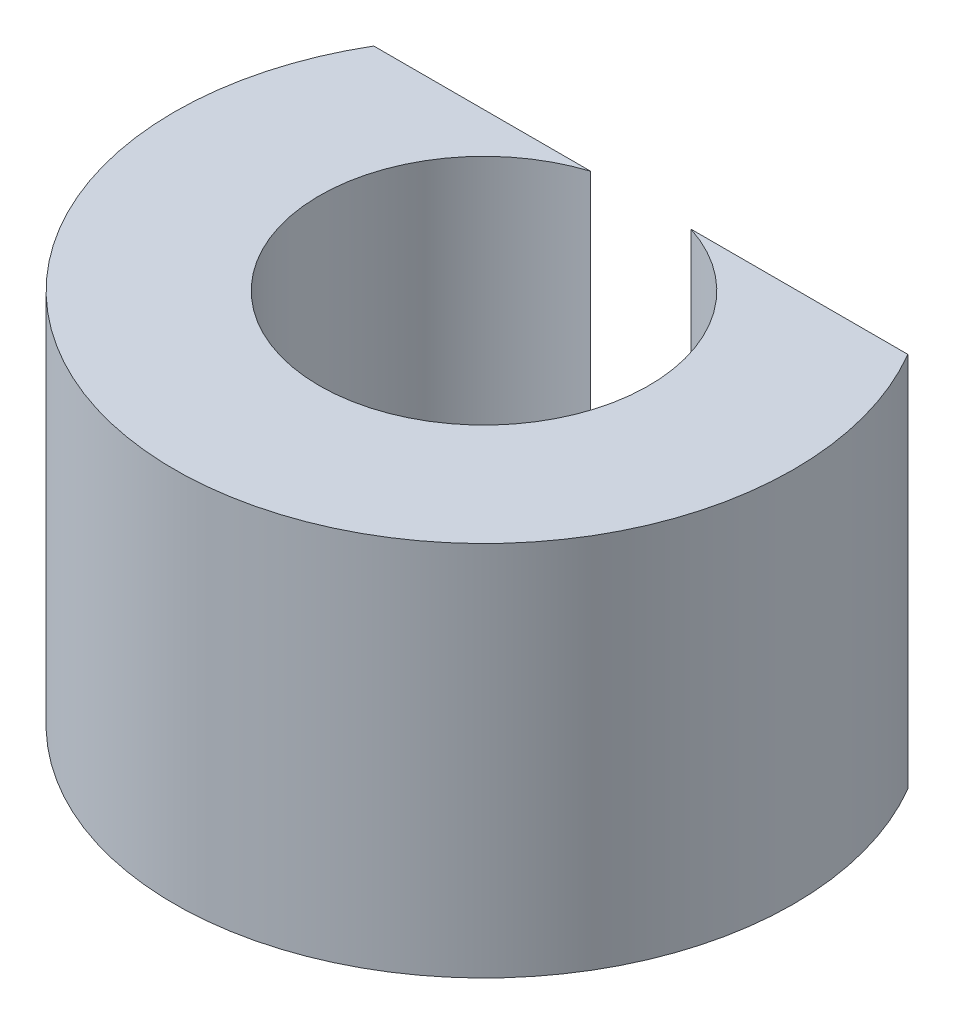
ISO-10303-21;
HEADER;
FILE_DESCRIPTION(('STEP AP214'),'2;1');
FILE_NAME('part.step','',(''),(''),'','','');
FILE_SCHEMA(('AUTOMOTIVE_DESIGN { 1 0 10303 214 1 1 1 1 }'));
ENDSEC;
DATA;
#1=APPLICATION_CONTEXT('core data for automotive mechanical design processes');
#2=APPLICATION_PROTOCOL_DEFINITION('international standard','automotive_design',2000,#1);
#3=PRODUCT_CONTEXT('',#1,'mechanical');
#4=PRODUCT('Part','Part','',(#3));
#5=PRODUCT_RELATED_PRODUCT_CATEGORY('part','',(#4));
#6=PRODUCT_DEFINITION_FORMATION('','',#4);
#7=PRODUCT_DEFINITION_CONTEXT('part definition',#1,'design');
#8=PRODUCT_DEFINITION('design','',#6,#7);
#9=PRODUCT_DEFINITION_SHAPE('','',#8);
#10=(LENGTH_UNIT() NAMED_UNIT(*) SI_UNIT(.MILLI.,.METRE.));
#11=(NAMED_UNIT(*) PLANE_ANGLE_UNIT() SI_UNIT($,.RADIAN.));
#12=(NAMED_UNIT(*) SI_UNIT($,.STERADIAN.) SOLID_ANGLE_UNIT());
#13=UNCERTAINTY_MEASURE_WITH_UNIT(LENGTH_MEASURE(1.E-05),#10,'distance_accuracy_value','');
#14=(GEOMETRIC_REPRESENTATION_CONTEXT(3) GLOBAL_UNCERTAINTY_ASSIGNED_CONTEXT((#13)) GLOBAL_UNIT_ASSIGNED_CONTEXT((#10,
#11,#12)) REPRESENTATION_CONTEXT('',''));
#15=CARTESIAN_POINT('',(0.,0.,0.));
#16=DIRECTION('',(0.,0.,1.));
#17=DIRECTION('',(1.,0.,0.));
#18=AXIS2_PLACEMENT_3D('',#15,#16,#17);
#19=CARTESIAN_POINT('',(0.,2.4,-1.));
#20=DIRECTION('',(0.,0.,-1.));
#21=DIRECTION('',(-1.,0.,0.));
#22=AXIS2_PLACEMENT_3D('',#19,#20,#21);
#23=PLANE('',#22);
#24=DIRECTION('',(0.,1.,0.));
#25=VECTOR('',#24,1.);
#26=CARTESIAN_POINT('',(-0.320156211871643,0.,-1.));
#27=LINE('',#26,#25);
#28=CARTESIAN_POINT('',(-0.320156211871643,0.,-1.));
#29=VERTEX_POINT('',#28);
#30=CARTESIAN_POINT('',(-0.320156211871643,2.4,-1.));
#31=VERTEX_POINT('',#30);
#32=EDGE_CURVE('E82',#29,#31,#27,.T.);
#33=ORIENTED_EDGE('',*,*,#32,.F.);
#34=DIRECTION('',(1.,0.,0.));
#35=VECTOR('',#34,1.);
#36=CARTESIAN_POINT('',(0.,0.,-1.));
#37=LINE('',#36,#35);
#38=CARTESIAN_POINT('',(-1.70312213302511,0.,-1.));
#39=VERTEX_POINT('',#38);
#40=EDGE_CURVE('E81',#39,#29,#37,.T.);
#41=ORIENTED_EDGE('',*,*,#40,.F.);
#42=DIRECTION('',(0.,-1.,0.));
#43=VECTOR('',#42,1.);
#44=CARTESIAN_POINT('',(-1.70312213302511,2.4,-1.));
#45=LINE('',#44,#43);
#46=CARTESIAN_POINT('',(-1.70312213302511,2.4,-1.));
#47=VERTEX_POINT('',#46);
#48=EDGE_CURVE('E47',#47,#39,#45,.T.);
#49=ORIENTED_EDGE('',*,*,#48,.F.);
#50=DIRECTION('',(1.,0.,0.));
#51=VECTOR('',#50,1.);
#52=CARTESIAN_POINT('',(0.,2.4,-1.));
#53=LINE('',#52,#51);
#54=EDGE_CURVE('E92',#47,#31,#53,.T.);
#55=ORIENTED_EDGE('',*,*,#54,.T.);
#56=EDGE_LOOP('',(#33,#41,#49,#55));
#57=FACE_BOUND('',#56,.T.);
#58=ADVANCED_FACE('F39',(#57),#23,.T.);
#59=DIRECTION('',(0.,1.,0.));
#60=VECTOR('',#59,1.);
#61=CARTESIAN_POINT('',(0.320156211871643,0.,-1.));
#62=LINE('',#61,#60);
#63=CARTESIAN_POINT('',(0.320156211871643,2.4,-1.));
#64=VERTEX_POINT('',#63);
#65=CARTESIAN_POINT('',(0.320156211871643,0.,-1.));
#66=VERTEX_POINT('',#65);
#67=EDGE_CURVE('E54',#64,#66,#62,.F.);
#68=ORIENTED_EDGE('',*,*,#67,.F.);
#69=CARTESIAN_POINT('',(1.70312213302511,2.4,-1.));
#70=VERTEX_POINT('',#69);
#71=EDGE_CURVE('E61',#64,#70,#53,.T.);
#72=ORIENTED_EDGE('',*,*,#71,.T.);
#73=DIRECTION('',(0.,-1.,0.));
#74=VECTOR('',#73,1.);
#75=CARTESIAN_POINT('',(1.70312213302511,2.4,-1.));
#76=LINE('',#75,#74);
#77=CARTESIAN_POINT('',(1.70312213302511,0.,-1.));
#78=VERTEX_POINT('',#77);
#79=EDGE_CURVE('E85',#70,#78,#76,.T.);
#80=ORIENTED_EDGE('',*,*,#79,.T.);
#81=EDGE_CURVE('E75',#66,#78,#37,.T.);
#82=ORIENTED_EDGE('',*,*,#81,.F.);
#83=EDGE_LOOP('',(#68,#72,#80,#82));
#84=FACE_BOUND('',#83,.T.);
#85=ADVANCED_FACE('F41',(#84),#23,.T.);
#86=CARTESIAN_POINT('',(0.,2.4,0.));
#87=DIRECTION('',(0.,-1.,0.));
#88=DIRECTION('',(0.,0.,-1.));
#89=AXIS2_PLACEMENT_3D('',#86,#87,#88);
#90=CYLINDRICAL_SURFACE('',#89,1.975);
#91=CARTESIAN_POINT('',(0.,0.,0.));
#92=DIRECTION('',(0.,1.,0.));
#93=DIRECTION('',(0.,0.,1.));
#94=AXIS2_PLACEMENT_3D('',#91,#92,#93);
#95=CIRCLE('',#94,1.975);
#96=EDGE_CURVE('E79',#39,#78,#95,.T.);
#97=ORIENTED_EDGE('',*,*,#96,.T.);
#98=ORIENTED_EDGE('',*,*,#79,.F.);
#99=CARTESIAN_POINT('',(0.,2.4,0.));
#100=DIRECTION('',(0.,1.,0.));
#101=DIRECTION('',(0.,0.,1.));
#102=AXIS2_PLACEMENT_3D('',#99,#100,#101);
#103=CIRCLE('',#102,1.975);
#104=EDGE_CURVE('E88',#47,#70,#103,.T.);
#105=ORIENTED_EDGE('',*,*,#104,.F.);
#106=ORIENTED_EDGE('',*,*,#48,.T.);
#107=EDGE_LOOP('',(#97,#98,#105,#106));
#108=FACE_BOUND('',#107,.T.);
#109=ADVANCED_FACE('F90',(#108),#90,.T.);
#110=CARTESIAN_POINT('',(0.,2.4,0.));
#111=DIRECTION('',(0.,1.,0.));
#112=DIRECTION('',(0.,0.,1.));
#113=AXIS2_PLACEMENT_3D('',#110,#111,#112);
#114=PLANE('',#113);
#115=CARTESIAN_POINT('',(0.,2.4,0.));
#116=DIRECTION('',(0.,1.,0.));
#117=DIRECTION('',(0.,0.,1.));
#118=AXIS2_PLACEMENT_3D('',#115,#116,#117);
#119=CIRCLE('',#118,1.05);
#120=EDGE_CURVE('E100',#31,#64,#119,.T.);
#121=ORIENTED_EDGE('',*,*,#120,.F.);
#122=ORIENTED_EDGE('',*,*,#54,.F.);
#123=ORIENTED_EDGE('',*,*,#104,.T.);
#124=ORIENTED_EDGE('',*,*,#71,.F.);
#125=EDGE_LOOP('',(#121,#122,#123,#124));
#126=FACE_BOUND('',#125,.T.);
#127=ADVANCED_FACE('F109',(#126),#114,.T.);
#128=CARTESIAN_POINT('',(0.,0.,0.));
#129=DIRECTION('',(0.,1.,0.));
#130=DIRECTION('',(0.,0.,1.));
#131=AXIS2_PLACEMENT_3D('',#128,#129,#130);
#132=PLANE('',#131);
#133=ORIENTED_EDGE('',*,*,#40,.T.);
#134=CARTESIAN_POINT('',(0.,0.,0.));
#135=DIRECTION('',(0.,1.,0.));
#136=DIRECTION('',(0.,0.,1.));
#137=AXIS2_PLACEMENT_3D('',#134,#135,#136);
#138=CIRCLE('',#137,1.05);
#139=EDGE_CURVE('E11',#29,#66,#138,.T.);
#140=ORIENTED_EDGE('',*,*,#139,.T.);
#141=ORIENTED_EDGE('',*,*,#81,.T.);
#142=ORIENTED_EDGE('',*,*,#96,.F.);
#143=EDGE_LOOP('',(#133,#140,#141,#142));
#144=FACE_BOUND('',#143,.T.);
#145=ADVANCED_FACE('F77',(#144),#132,.F.);
#146=CARTESIAN_POINT('',(0.,0.,0.));
#147=DIRECTION('',(0.,1.,0.));
#148=DIRECTION('',(0.,0.,1.));
#149=AXIS2_PLACEMENT_3D('',#146,#147,#148);
#150=CYLINDRICAL_SURFACE('',#149,1.05);
#151=ORIENTED_EDGE('',*,*,#32,.T.);
#152=ORIENTED_EDGE('',*,*,#120,.T.);
#153=ORIENTED_EDGE('',*,*,#67,.T.);
#154=ORIENTED_EDGE('',*,*,#139,.F.);
#155=EDGE_LOOP('',(#151,#152,#153,#154));
#156=FACE_BOUND('',#155,.T.);
#157=ADVANCED_FACE('F103',(#156),#150,.F.);
#158=CLOSED_SHELL('',(#58,#85,#109,#127,#145,#157));
#159=MANIFOLD_SOLID_BREP('B2',#158);
#160=ADVANCED_BREP_SHAPE_REPRESENTATION('',(#18,#159),#14);
#161=SHAPE_DEFINITION_REPRESENTATION(#9,#160);
ENDSEC;
END-ISO-10303-21;
